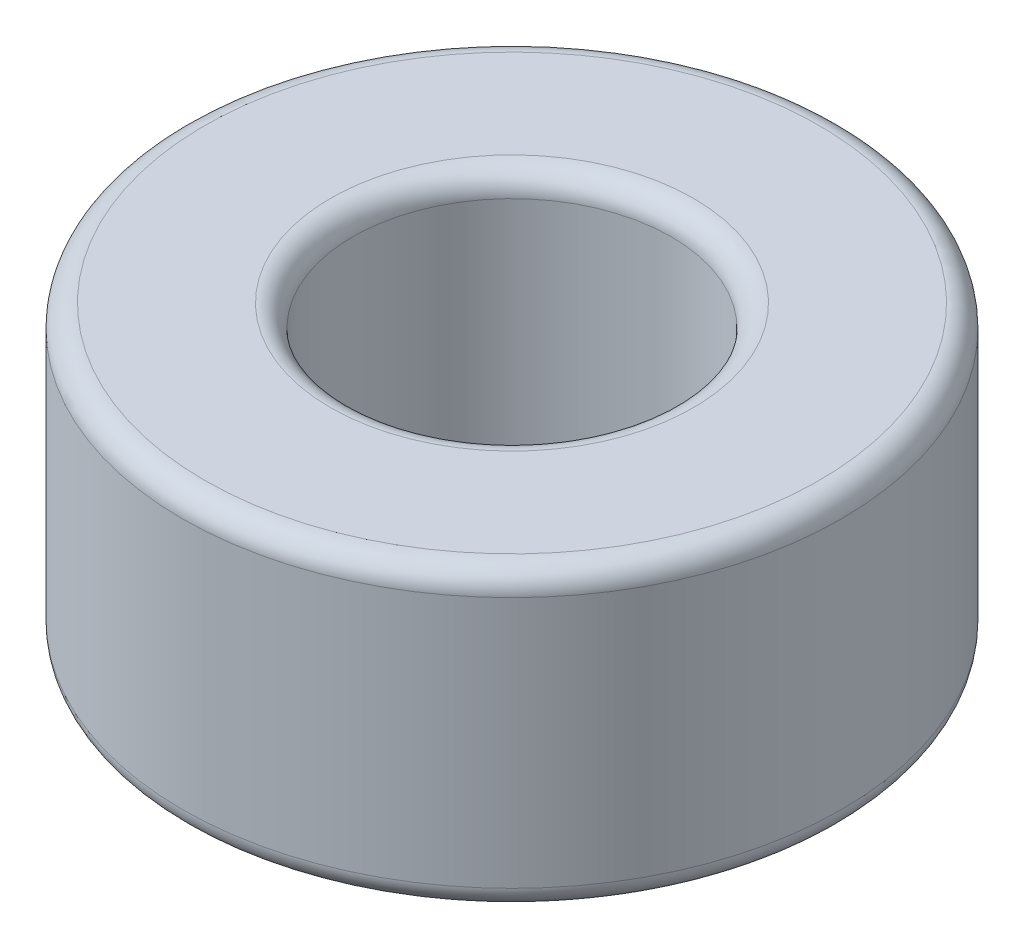
ISO-10303-21;
HEADER;
FILE_DESCRIPTION(('STEP AP214'),'2;1');
FILE_NAME('part.step','',(''),(''),'','','');
FILE_SCHEMA(('AUTOMOTIVE_DESIGN { 1 0 10303 214 1 1 1 1 }'));
ENDSEC;
DATA;
#1=APPLICATION_CONTEXT('core data for automotive mechanical design processes');
#2=APPLICATION_PROTOCOL_DEFINITION('international standard','automotive_design',2000,#1);
#3=PRODUCT_CONTEXT('',#1,'mechanical');
#4=PRODUCT('Part','Part','',(#3));
#5=PRODUCT_RELATED_PRODUCT_CATEGORY('part','',(#4));
#6=PRODUCT_DEFINITION_FORMATION('','',#4);
#7=PRODUCT_DEFINITION_CONTEXT('part definition',#1,'design');
#8=PRODUCT_DEFINITION('design','',#6,#7);
#9=PRODUCT_DEFINITION_SHAPE('','',#8);
#10=(LENGTH_UNIT() NAMED_UNIT(*) SI_UNIT(.MILLI.,.METRE.));
#11=(NAMED_UNIT(*) PLANE_ANGLE_UNIT() SI_UNIT($,.RADIAN.));
#12=(NAMED_UNIT(*) SI_UNIT($,.STERADIAN.) SOLID_ANGLE_UNIT());
#13=UNCERTAINTY_MEASURE_WITH_UNIT(LENGTH_MEASURE(1.E-05),#10,'distance_accuracy_value','');
#14=(GEOMETRIC_REPRESENTATION_CONTEXT(3) GLOBAL_UNCERTAINTY_ASSIGNED_CONTEXT((#13)) GLOBAL_UNIT_ASSIGNED_CONTEXT((#10,
#11,#12)) REPRESENTATION_CONTEXT('',''));
#15=CARTESIAN_POINT('',(0.,0.,0.));
#16=DIRECTION('',(0.,0.,1.));
#17=DIRECTION('',(1.,0.,0.));
#18=AXIS2_PLACEMENT_3D('',#15,#16,#17);
#19=CARTESIAN_POINT('',(0.,4.,0.));
#20=DIRECTION('',(0.,1.,0.));
#21=DIRECTION('',(0.,0.,1.));
#22=AXIS2_PLACEMENT_3D('',#19,#20,#21);
#23=PLANE('',#22);
#24=CARTESIAN_POINT('',(0.,4.,0.));
#25=DIRECTION('',(0.,1.,0.));
#26=DIRECTION('',(0.,0.,1.));
#27=AXIS2_PLACEMENT_3D('',#24,#25,#26);
#28=CIRCLE('',#27,2.45);
#29=CARTESIAN_POINT('',(0.,4.,2.45));
#30=VERTEX_POINT('',#29);
#31=EDGE_CURVE('E10',#30,#30,#28,.F.);
#32=ORIENTED_EDGE('',*,*,#31,.T.);
#33=EDGE_LOOP('',(#32));
#34=FACE_BOUND('',#33,.T.);
#35=CARTESIAN_POINT('',(0.,4.,0.));
#36=DIRECTION('',(0.,1.,0.));
#37=DIRECTION('',(0.,0.,1.));
#38=AXIS2_PLACEMENT_3D('',#35,#36,#37);
#39=CIRCLE('',#38,4.15);
#40=CARTESIAN_POINT('',(0.,4.,4.15));
#41=VERTEX_POINT('',#40);
#42=EDGE_CURVE('E38',#41,#41,#39,.T.);
#43=ORIENTED_EDGE('',*,*,#42,.T.);
#44=EDGE_LOOP('',(#43));
#45=FACE_BOUND('',#44,.T.);
#46=ADVANCED_FACE('F31',(#34,#45),#23,.T.);
#47=CARTESIAN_POINT('',(0.,0.,0.));
#48=DIRECTION('',(0.,1.,0.));
#49=DIRECTION('',(0.,0.,1.));
#50=AXIS2_PLACEMENT_3D('',#47,#48,#49);
#51=PLANE('',#50);
#52=CARTESIAN_POINT('',(0.,0.,0.));
#53=DIRECTION('',(0.,1.,0.));
#54=DIRECTION('',(0.,0.,1.));
#55=AXIS2_PLACEMENT_3D('',#52,#53,#54);
#56=CIRCLE('',#55,2.45);
#57=CARTESIAN_POINT('',(0.,0.,2.45));
#58=VERTEX_POINT('',#57);
#59=EDGE_CURVE('E57',#58,#58,#56,.T.);
#60=ORIENTED_EDGE('',*,*,#59,.T.);
#61=EDGE_LOOP('',(#60));
#62=FACE_BOUND('',#61,.T.);
#63=CARTESIAN_POINT('',(0.,0.,0.));
#64=DIRECTION('',(0.,1.,0.));
#65=DIRECTION('',(0.,0.,1.));
#66=AXIS2_PLACEMENT_3D('',#63,#64,#65);
#67=CIRCLE('',#66,4.15);
#68=CARTESIAN_POINT('',(0.,0.,4.15));
#69=VERTEX_POINT('',#68);
#70=EDGE_CURVE('E60',#69,#69,#67,.F.);
#71=ORIENTED_EDGE('',*,*,#70,.T.);
#72=EDGE_LOOP('',(#71));
#73=FACE_BOUND('',#72,.T.);
#74=ADVANCED_FACE('F64',(#62,#73),#51,.F.);
#75=CARTESIAN_POINT('',(0.,4.,0.));
#76=DIRECTION('',(0.,-1.,0.));
#77=DIRECTION('',(0.,0.,-1.));
#78=AXIS2_PLACEMENT_3D('',#75,#76,#77);
#79=CYLINDRICAL_SURFACE('',#78,4.45);
#80=CARTESIAN_POINT('',(0.,0.3,0.));
#81=DIRECTION('',(0.,1.,0.));
#82=DIRECTION('',(0.,0.,1.));
#83=AXIS2_PLACEMENT_3D('',#80,#81,#82);
#84=CIRCLE('',#83,4.45);
#85=CARTESIAN_POINT('',(0.,0.3,4.45));
#86=VERTEX_POINT('',#85);
#87=EDGE_CURVE('E42',#86,#86,#84,.T.);
#88=ORIENTED_EDGE('',*,*,#87,.T.);
#89=EDGE_LOOP('',(#88));
#90=FACE_BOUND('',#89,.T.);
#91=CARTESIAN_POINT('',(0.,3.7,0.));
#92=DIRECTION('',(0.,1.,0.));
#93=DIRECTION('',(0.,0.,1.));
#94=AXIS2_PLACEMENT_3D('',#91,#92,#93);
#95=CIRCLE('',#94,4.45);
#96=CARTESIAN_POINT('',(0.,3.7,4.45));
#97=VERTEX_POINT('',#96);
#98=EDGE_CURVE('E46',#97,#97,#95,.F.);
#99=ORIENTED_EDGE('',*,*,#98,.T.);
#100=EDGE_LOOP('',(#99));
#101=FACE_BOUND('',#100,.T.);
#102=ADVANCED_FACE('F74',(#90,#101),#79,.T.);
#103=CARTESIAN_POINT('',(0.,4.,0.));
#104=DIRECTION('',(0.,-1.,0.));
#105=DIRECTION('',(0.,0.,-1.));
#106=AXIS2_PLACEMENT_3D('',#103,#104,#105);
#107=CYLINDRICAL_SURFACE('',#106,2.15);
#108=CARTESIAN_POINT('',(0.,0.3,0.));
#109=DIRECTION('',(0.,1.,0.));
#110=DIRECTION('',(0.,0.,1.));
#111=AXIS2_PLACEMENT_3D('',#108,#109,#110);
#112=CIRCLE('',#111,2.15);
#113=CARTESIAN_POINT('',(0.,0.3,2.15));
#114=VERTEX_POINT('',#113);
#115=EDGE_CURVE('E51',#114,#114,#112,.F.);
#116=ORIENTED_EDGE('',*,*,#115,.T.);
#117=EDGE_LOOP('',(#116));
#118=FACE_BOUND('',#117,.T.);
#119=CARTESIAN_POINT('',(0.,3.7,0.));
#120=DIRECTION('',(0.,1.,0.));
#121=DIRECTION('',(0.,0.,1.));
#122=AXIS2_PLACEMENT_3D('',#119,#120,#121);
#123=CIRCLE('',#122,2.15);
#124=CARTESIAN_POINT('',(0.,3.7,2.15));
#125=VERTEX_POINT('',#124);
#126=EDGE_CURVE('E54',#125,#125,#123,.T.);
#127=ORIENTED_EDGE('',*,*,#126,.T.);
#128=EDGE_LOOP('',(#127));
#129=FACE_BOUND('',#128,.T.);
#130=ADVANCED_FACE('F77',(#118,#129),#107,.F.);
#131=CARTESIAN_POINT('',(0.,0.3,0.));
#132=DIRECTION('',(0.,1.,0.));
#133=DIRECTION('',(0.,0.,1.));
#134=AXIS2_PLACEMENT_3D('',#131,#132,#133);
#135=TOROIDAL_SURFACE('',#134,2.45,0.3);
#136=ORIENTED_EDGE('',*,*,#115,.F.);
#137=EDGE_LOOP('',(#136));
#138=FACE_BOUND('',#137,.T.);
#139=ORIENTED_EDGE('',*,*,#59,.F.);
#140=EDGE_LOOP('',(#139));
#141=FACE_BOUND('',#140,.T.);
#142=ADVANCED_FACE('F70',(#138,#141),#135,.T.);
#143=CARTESIAN_POINT('',(0.,0.3,0.));
#144=DIRECTION('',(0.,1.,0.));
#145=DIRECTION('',(0.,0.,1.));
#146=AXIS2_PLACEMENT_3D('',#143,#144,#145);
#147=TOROIDAL_SURFACE('',#146,4.15,0.3);
#148=ORIENTED_EDGE('',*,*,#70,.F.);
#149=EDGE_LOOP('',(#148));
#150=FACE_BOUND('',#149,.T.);
#151=ORIENTED_EDGE('',*,*,#87,.F.);
#152=EDGE_LOOP('',(#151));
#153=FACE_BOUND('',#152,.T.);
#154=ADVANCED_FACE('F66',(#150,#153),#147,.T.);
#155=CARTESIAN_POINT('',(0.,3.7,0.));
#156=DIRECTION('',(0.,1.,0.));
#157=DIRECTION('',(0.,0.,1.));
#158=AXIS2_PLACEMENT_3D('',#155,#156,#157);
#159=TOROIDAL_SURFACE('',#158,2.45,0.3);
#160=ORIENTED_EDGE('',*,*,#31,.F.);
#161=EDGE_LOOP('',(#160));
#162=FACE_BOUND('',#161,.T.);
#163=ORIENTED_EDGE('',*,*,#126,.F.);
#164=EDGE_LOOP('',(#163));
#165=FACE_BOUND('',#164,.T.);
#166=ADVANCED_FACE('F69',(#162,#165),#159,.T.);
#167=CARTESIAN_POINT('',(0.,3.7,0.));
#168=DIRECTION('',(0.,1.,0.));
#169=DIRECTION('',(0.,0.,1.));
#170=AXIS2_PLACEMENT_3D('',#167,#168,#169);
#171=TOROIDAL_SURFACE('',#170,4.15,0.3);
#172=ORIENTED_EDGE('',*,*,#98,.F.);
#173=EDGE_LOOP('',(#172));
#174=FACE_BOUND('',#173,.T.);
#175=ORIENTED_EDGE('',*,*,#42,.F.);
#176=EDGE_LOOP('',(#175));
#177=FACE_BOUND('',#176,.T.);
#178=ADVANCED_FACE('F33',(#174,#177),#171,.T.);
#179=CLOSED_SHELL('',(#46,#74,#102,#130,#142,#154,#166,#178));
#180=MANIFOLD_SOLID_BREP('B2',#179);
#181=ADVANCED_BREP_SHAPE_REPRESENTATION('',(#18,#180),#14);
#182=SHAPE_DEFINITION_REPRESENTATION(#9,#181);
ENDSEC;
END-ISO-10303-21;
